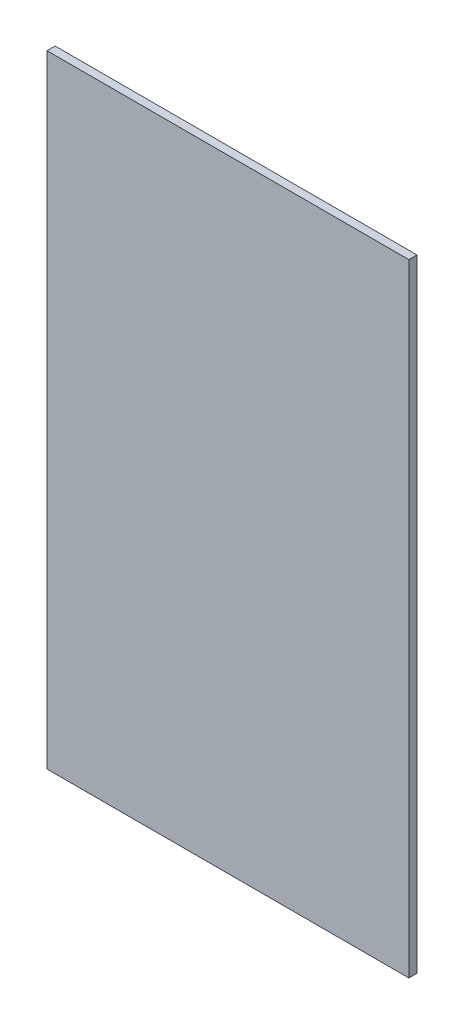
ISO-10303-21;
HEADER;
FILE_DESCRIPTION(('STEP AP214'),'2;1');
FILE_NAME('part.step','',(''),(''),'','','');
FILE_SCHEMA(('AUTOMOTIVE_DESIGN { 1 0 10303 214 1 1 1 1 }'));
ENDSEC;
DATA;
#1=APPLICATION_CONTEXT('core data for automotive mechanical design processes');
#2=APPLICATION_PROTOCOL_DEFINITION('international standard','automotive_design',2000,#1);
#3=PRODUCT_CONTEXT('',#1,'mechanical');
#4=PRODUCT('Part','Part','',(#3));
#5=PRODUCT_RELATED_PRODUCT_CATEGORY('part','',(#4));
#6=PRODUCT_DEFINITION_FORMATION('','',#4);
#7=PRODUCT_DEFINITION_CONTEXT('part definition',#1,'design');
#8=PRODUCT_DEFINITION('design','',#6,#7);
#9=PRODUCT_DEFINITION_SHAPE('','',#8);
#10=(LENGTH_UNIT() NAMED_UNIT(*) SI_UNIT(.MILLI.,.METRE.));
#11=(NAMED_UNIT(*) PLANE_ANGLE_UNIT() SI_UNIT($,.RADIAN.));
#12=(NAMED_UNIT(*) SI_UNIT($,.STERADIAN.) SOLID_ANGLE_UNIT());
#13=UNCERTAINTY_MEASURE_WITH_UNIT(LENGTH_MEASURE(1.E-05),#10,'distance_accuracy_value','');
#14=(GEOMETRIC_REPRESENTATION_CONTEXT(3) GLOBAL_UNCERTAINTY_ASSIGNED_CONTEXT((#13)) GLOBAL_UNIT_ASSIGNED_CONTEXT((#10,
#11,#12)) REPRESENTATION_CONTEXT('',''));
#15=CARTESIAN_POINT('',(0.,0.,0.));
#16=DIRECTION('',(0.,0.,1.));
#17=DIRECTION('',(1.,0.,0.));
#18=AXIS2_PLACEMENT_3D('',#15,#16,#17);
#19=CARTESIAN_POINT('',(-7.54951656745107E-13,0.,0.));
#20=DIRECTION('',(0.,0.,1.));
#21=DIRECTION('',(1.,0.,0.));
#22=AXIS2_PLACEMENT_3D('',#19,#20,#21);
#23=PLANE('',#22);
#24=DIRECTION('',(0.,1.,0.));
#25=VECTOR('',#24,1.);
#26=CARTESIAN_POINT('',(56.514999999999,-97.1549999999982,0.));
#27=LINE('',#26,#25);
#28=CARTESIAN_POINT('',(56.514999999999,-97.1549999999982,0.));
#29=VERTEX_POINT('',#28);
#30=CARTESIAN_POINT('',(56.5149999999987,97.1549999999982,0.));
#31=VERTEX_POINT('',#30);
#32=EDGE_CURVE('E19',#29,#31,#27,.T.);
#33=ORIENTED_EDGE('',*,*,#32,.F.);
#34=DIRECTION('',(1.,0.,0.));
#35=VECTOR('',#34,1.);
#36=CARTESIAN_POINT('',(-56.515,-97.1549999999982,0.));
#37=LINE('',#36,#35);
#38=CARTESIAN_POINT('',(-56.515,-97.1549999999982,0.));
#39=VERTEX_POINT('',#38);
#40=EDGE_CURVE('E88',#39,#29,#37,.T.);
#41=ORIENTED_EDGE('',*,*,#40,.F.);
#42=DIRECTION('',(0.,-1.,0.));
#43=VECTOR('',#42,1.);
#44=CARTESIAN_POINT('',(-56.515,97.1549999999982,0.));
#45=LINE('',#44,#43);
#46=CARTESIAN_POINT('',(-56.515,97.1549999999982,0.));
#47=VERTEX_POINT('',#46);
#48=EDGE_CURVE('E70',#47,#39,#45,.T.);
#49=ORIENTED_EDGE('',*,*,#48,.F.);
#50=DIRECTION('',(-1.,0.,0.));
#51=VECTOR('',#50,1.);
#52=CARTESIAN_POINT('',(56.5149999999987,97.1549999999982,0.));
#53=LINE('',#52,#51);
#54=EDGE_CURVE('E106',#31,#47,#53,.T.);
#55=ORIENTED_EDGE('',*,*,#54,.F.);
#56=EDGE_LOOP('',(#33,#41,#49,#55));
#57=FACE_BOUND('',#56,.T.);
#58=ADVANCED_FACE('F16',(#57),#23,.F.);
#59=CARTESIAN_POINT('',(-7.54951656745107E-13,0.,2.54));
#60=DIRECTION('',(0.,0.,1.));
#61=DIRECTION('',(1.,0.,0.));
#62=AXIS2_PLACEMENT_3D('',#59,#60,#61);
#63=PLANE('',#62);
#64=DIRECTION('',(0.,1.,0.));
#65=VECTOR('',#64,1.);
#66=CARTESIAN_POINT('',(56.514999999999,-97.1549999999982,2.54));
#67=LINE('',#66,#65);
#68=CARTESIAN_POINT('',(56.514999999999,-97.1549999999982,2.54));
#69=VERTEX_POINT('',#68);
#70=CARTESIAN_POINT('',(56.5149999999987,97.1549999999982,2.54));
#71=VERTEX_POINT('',#70);
#72=EDGE_CURVE('E10',#69,#71,#67,.T.);
#73=ORIENTED_EDGE('',*,*,#72,.T.);
#74=DIRECTION('',(-1.,0.,0.));
#75=VECTOR('',#74,1.);
#76=CARTESIAN_POINT('',(56.5149999999987,97.1549999999982,2.54));
#77=LINE('',#76,#75);
#78=CARTESIAN_POINT('',(-56.515,97.1549999999982,2.54));
#79=VERTEX_POINT('',#78);
#80=EDGE_CURVE('E103',#71,#79,#77,.T.);
#81=ORIENTED_EDGE('',*,*,#80,.T.);
#82=DIRECTION('',(0.,-1.,0.));
#83=VECTOR('',#82,1.);
#84=CARTESIAN_POINT('',(-56.515,97.1549999999982,2.54));
#85=LINE('',#84,#83);
#86=CARTESIAN_POINT('',(-56.515,-97.1549999999982,2.54));
#87=VERTEX_POINT('',#86);
#88=EDGE_CURVE('E82',#79,#87,#85,.T.);
#89=ORIENTED_EDGE('',*,*,#88,.T.);
#90=DIRECTION('',(1.,0.,0.));
#91=VECTOR('',#90,1.);
#92=CARTESIAN_POINT('',(-56.515,-97.1549999999982,2.54));
#93=LINE('',#92,#91);
#94=EDGE_CURVE('E89',#87,#69,#93,.T.);
#95=ORIENTED_EDGE('',*,*,#94,.T.);
#96=EDGE_LOOP('',(#73,#81,#89,#95));
#97=FACE_BOUND('',#96,.T.);
#98=ADVANCED_FACE('F119',(#97),#63,.T.);
#99=CARTESIAN_POINT('',(56.514999999999,-97.1549999999982,0.));
#100=DIRECTION('',(1.,0.,0.));
#101=DIRECTION('',(0.,1.,0.));
#102=AXIS2_PLACEMENT_3D('',#99,#100,#101);
#103=PLANE('',#102);
#104=ORIENTED_EDGE('',*,*,#32,.T.);
#105=DIRECTION('',(0.,0.,1.));
#106=VECTOR('',#105,1.);
#107=CARTESIAN_POINT('',(56.5149999999987,97.1549999999982,0.));
#108=LINE('',#107,#106);
#109=EDGE_CURVE('E105',#31,#71,#108,.T.);
#110=ORIENTED_EDGE('',*,*,#109,.T.);
#111=ORIENTED_EDGE('',*,*,#72,.F.);
#112=DIRECTION('',(0.,0.,1.));
#113=VECTOR('',#112,1.);
#114=CARTESIAN_POINT('',(56.514999999999,-97.1549999999982,0.));
#115=LINE('',#114,#113);
#116=EDGE_CURVE('E93',#29,#69,#115,.T.);
#117=ORIENTED_EDGE('',*,*,#116,.F.);
#118=EDGE_LOOP('',(#104,#110,#111,#117));
#119=FACE_BOUND('',#118,.T.);
#120=ADVANCED_FACE('F124',(#119),#103,.T.);
#121=CARTESIAN_POINT('',(56.5149999999987,97.1549999999982,0.));
#122=DIRECTION('',(0.,1.,0.));
#123=DIRECTION('',(1.,0.,0.));
#124=AXIS2_PLACEMENT_3D('',#121,#122,#123);
#125=PLANE('',#124);
#126=ORIENTED_EDGE('',*,*,#54,.T.);
#127=DIRECTION('',(0.,0.,1.));
#128=VECTOR('',#127,1.);
#129=CARTESIAN_POINT('',(-56.515,97.1549999999982,0.));
#130=LINE('',#129,#128);
#131=EDGE_CURVE('E77',#47,#79,#130,.T.);
#132=ORIENTED_EDGE('',*,*,#131,.T.);
#133=ORIENTED_EDGE('',*,*,#80,.F.);
#134=ORIENTED_EDGE('',*,*,#109,.F.);
#135=EDGE_LOOP('',(#126,#132,#133,#134));
#136=FACE_BOUND('',#135,.T.);
#137=ADVANCED_FACE('F142',(#136),#125,.T.);
#138=CARTESIAN_POINT('',(-56.515,97.1549999999982,0.));
#139=DIRECTION('',(-1.,0.,0.));
#140=DIRECTION('',(0.,1.,0.));
#141=AXIS2_PLACEMENT_3D('',#138,#139,#140);
#142=PLANE('',#141);
#143=ORIENTED_EDGE('',*,*,#48,.T.);
#144=DIRECTION('',(0.,0.,1.));
#145=VECTOR('',#144,1.);
#146=CARTESIAN_POINT('',(-56.515,-97.1549999999982,0.));
#147=LINE('',#146,#145);
#148=EDGE_CURVE('E74',#39,#87,#147,.T.);
#149=ORIENTED_EDGE('',*,*,#148,.T.);
#150=ORIENTED_EDGE('',*,*,#88,.F.);
#151=ORIENTED_EDGE('',*,*,#131,.F.);
#152=EDGE_LOOP('',(#143,#149,#150,#151));
#153=FACE_BOUND('',#152,.T.);
#154=ADVANCED_FACE('F72',(#153),#142,.T.);
#155=CARTESIAN_POINT('',(-56.515,-97.1549999999982,0.));
#156=DIRECTION('',(0.,-1.,0.));
#157=DIRECTION('',(0.,0.,-1.));
#158=AXIS2_PLACEMENT_3D('',#155,#156,#157);
#159=PLANE('',#158);
#160=ORIENTED_EDGE('',*,*,#40,.T.);
#161=ORIENTED_EDGE('',*,*,#116,.T.);
#162=ORIENTED_EDGE('',*,*,#94,.F.);
#163=ORIENTED_EDGE('',*,*,#148,.F.);
#164=EDGE_LOOP('',(#160,#161,#162,#163));
#165=FACE_BOUND('',#164,.T.);
#166=ADVANCED_FACE('F86',(#165),#159,.T.);
#167=CLOSED_SHELL('',(#58,#98,#120,#137,#154,#166));
#168=MANIFOLD_SOLID_BREP('B1',#167);
#169=ADVANCED_BREP_SHAPE_REPRESENTATION('',(#18,#168),#14);
#170=SHAPE_DEFINITION_REPRESENTATION(#9,#169);
ENDSEC;
END-ISO-10303-21;
